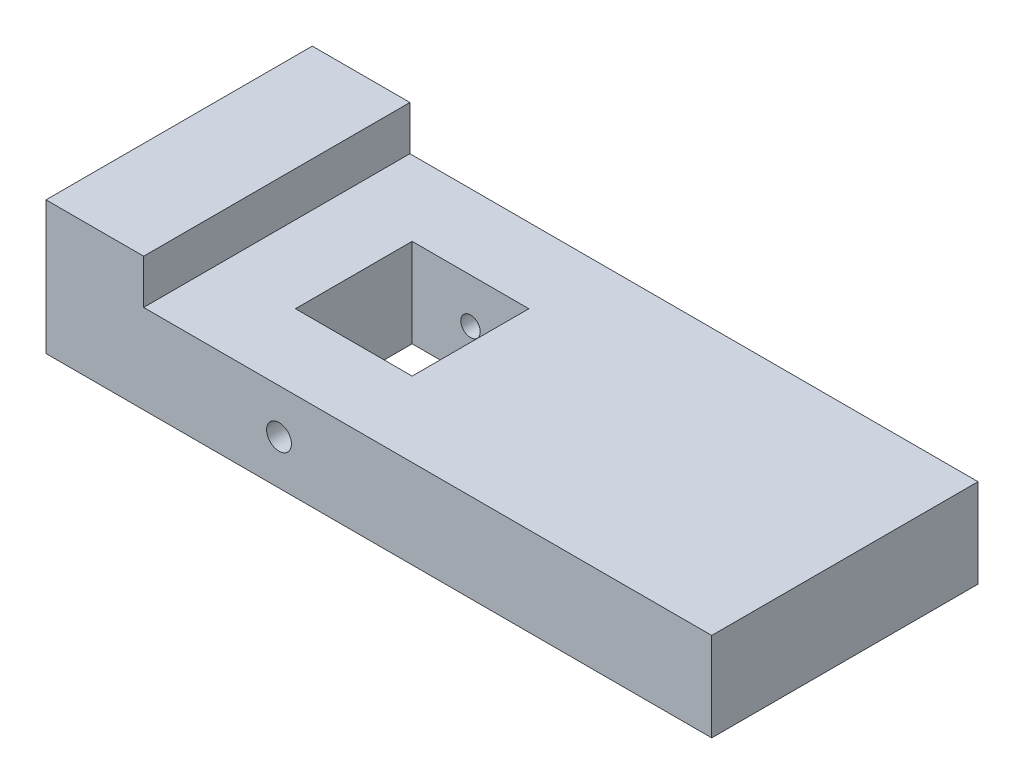
ISO-10303-21;
HEADER;
FILE_DESCRIPTION(('STEP AP214'),'2;1');
FILE_NAME('part.step','',(''),(''),'','','');
FILE_SCHEMA(('AUTOMOTIVE_DESIGN { 1 0 10303 214 1 1 1 1 }'));
ENDSEC;
DATA;
#1=APPLICATION_CONTEXT('core data for automotive mechanical design processes');
#2=APPLICATION_PROTOCOL_DEFINITION('international standard','automotive_design',2000,#1);
#3=PRODUCT_CONTEXT('',#1,'mechanical');
#4=PRODUCT('Part','Part','',(#3));
#5=PRODUCT_RELATED_PRODUCT_CATEGORY('part','',(#4));
#6=PRODUCT_DEFINITION_FORMATION('','',#4);
#7=PRODUCT_DEFINITION_CONTEXT('part definition',#1,'design');
#8=PRODUCT_DEFINITION('design','',#6,#7);
#9=PRODUCT_DEFINITION_SHAPE('','',#8);
#10=(LENGTH_UNIT() NAMED_UNIT(*) SI_UNIT(.MILLI.,.METRE.));
#11=(NAMED_UNIT(*) PLANE_ANGLE_UNIT() SI_UNIT($,.RADIAN.));
#12=(NAMED_UNIT(*) SI_UNIT($,.STERADIAN.) SOLID_ANGLE_UNIT());
#13=UNCERTAINTY_MEASURE_WITH_UNIT(LENGTH_MEASURE(1.E-05),#10,'distance_accuracy_value','');
#14=(GEOMETRIC_REPRESENTATION_CONTEXT(3) GLOBAL_UNCERTAINTY_ASSIGNED_CONTEXT((#13)) GLOBAL_UNIT_ASSIGNED_CONTEXT((#10,
#11,#12)) REPRESENTATION_CONTEXT('',''));
#15=CARTESIAN_POINT('',(0.,0.,0.));
#16=DIRECTION('',(0.,0.,1.));
#17=DIRECTION('',(1.,0.,0.));
#18=AXIS2_PLACEMENT_3D('',#15,#16,#17);
#19=CARTESIAN_POINT('',(-22.5,10.,-30.));
#20=DIRECTION('',(0.,0.,1.));
#21=DIRECTION('',(1.,0.,0.));
#22=AXIS2_PLACEMENT_3D('',#19,#20,#21);
#23=CYLINDRICAL_SURFACE('',#22,2.2);
#24=CARTESIAN_POINT('',(-22.5,10.,13.15));
#25=DIRECTION('',(0.,0.,1.));
#26=DIRECTION('',(1.,0.,0.));
#27=AXIS2_PLACEMENT_3D('',#24,#25,#26);
#28=CIRCLE('',#27,2.2);
#29=CARTESIAN_POINT('',(-20.3,10.,13.15));
#30=VERTEX_POINT('',#29);
#31=EDGE_CURVE('E200',#30,#30,#28,.T.);
#32=ORIENTED_EDGE('',*,*,#31,.F.);
#33=EDGE_LOOP('',(#32));
#34=FACE_BOUND('',#33,.T.);
#35=CARTESIAN_POINT('',(-22.5,10.,24.));
#36=DIRECTION('',(0.,0.,1.));
#37=DIRECTION('',(1.,0.,0.));
#38=AXIS2_PLACEMENT_3D('',#35,#36,#37);
#39=CIRCLE('',#38,2.2);
#40=CARTESIAN_POINT('',(-20.3,10.,24.));
#41=VERTEX_POINT('',#40);
#42=EDGE_CURVE('E43',#41,#41,#39,.F.);
#43=ORIENTED_EDGE('',*,*,#42,.F.);
#44=EDGE_LOOP('',(#43));
#45=FACE_BOUND('',#44,.T.);
#46=ADVANCED_FACE('F39',(#34,#45),#23,.F.);
#47=CARTESIAN_POINT('',(0.,20.,0.));
#48=DIRECTION('',(0.,-1.,0.));
#49=DIRECTION('',(0.,0.,-1.));
#50=AXIS2_PLACEMENT_3D('',#47,#48,#49);
#51=PLANE('',#50);
#52=DIRECTION('',(1.,0.,0.));
#53=VECTOR('',#52,1.);
#54=CARTESIAN_POINT('',(-9.35,20.,13.15));
#55=LINE('',#54,#53);
#56=CARTESIAN_POINT('',(-35.65,20.,13.15));
#57=VERTEX_POINT('',#56);
#58=CARTESIAN_POINT('',(-9.35,20.,13.15));
#59=VERTEX_POINT('',#58);
#60=EDGE_CURVE('E148',#57,#59,#55,.T.);
#61=ORIENTED_EDGE('',*,*,#60,.F.);
#62=DIRECTION('',(0.,0.,1.));
#63=VECTOR('',#62,1.);
#64=CARTESIAN_POINT('',(-35.65,20.,13.15));
#65=LINE('',#64,#63);
#66=CARTESIAN_POINT('',(-35.65,20.,-13.15));
#67=VERTEX_POINT('',#66);
#68=EDGE_CURVE('E56',#67,#57,#65,.T.);
#69=ORIENTED_EDGE('',*,*,#68,.F.);
#70=DIRECTION('',(-1.,0.,0.));
#71=VECTOR('',#70,1.);
#72=CARTESIAN_POINT('',(-9.35,20.,-13.15));
#73=LINE('',#72,#71);
#74=CARTESIAN_POINT('',(-9.35,20.,-13.15));
#75=VERTEX_POINT('',#74);
#76=EDGE_CURVE('E136',#75,#67,#73,.T.);
#77=ORIENTED_EDGE('',*,*,#76,.F.);
#78=DIRECTION('',(0.,0.,-1.));
#79=VECTOR('',#78,1.);
#80=CARTESIAN_POINT('',(-9.35,20.,13.15));
#81=LINE('',#80,#79);
#82=EDGE_CURVE('E139',#59,#75,#81,.T.);
#83=ORIENTED_EDGE('',*,*,#82,.F.);
#84=EDGE_LOOP('',(#61,#69,#77,#83));
#85=FACE_BOUND('',#84,.T.);
#86=DIRECTION('',(0.,0.,-1.));
#87=VECTOR('',#86,1.);
#88=CARTESIAN_POINT('',(-53.,20.,30.));
#89=LINE('',#88,#87);
#90=CARTESIAN_POINT('',(-53.,20.,30.));
#91=VERTEX_POINT('',#90);
#92=CARTESIAN_POINT('',(-53.,20.,-30.));
#93=VERTEX_POINT('',#92);
#94=EDGE_CURVE('E154',#91,#93,#89,.T.);
#95=ORIENTED_EDGE('',*,*,#94,.F.);
#96=DIRECTION('',(1.,0.,0.));
#97=VECTOR('',#96,1.);
#98=CARTESIAN_POINT('',(-75.,20.,30.));
#99=LINE('',#98,#97);
#100=CARTESIAN_POINT('',(75.,20.,30.));
#101=VERTEX_POINT('',#100);
#102=EDGE_CURVE('E184',#91,#101,#99,.T.);
#103=ORIENTED_EDGE('',*,*,#102,.T.);
#104=DIRECTION('',(0.,0.,-1.));
#105=VECTOR('',#104,1.);
#106=CARTESIAN_POINT('',(75.,20.,30.));
#107=LINE('',#106,#105);
#108=CARTESIAN_POINT('',(75.,20.,-30.));
#109=VERTEX_POINT('',#108);
#110=EDGE_CURVE('E178',#101,#109,#107,.T.);
#111=ORIENTED_EDGE('',*,*,#110,.T.);
#112=DIRECTION('',(-1.,0.,0.));
#113=VECTOR('',#112,1.);
#114=CARTESIAN_POINT('',(-75.,20.,-30.));
#115=LINE('',#114,#113);
#116=EDGE_CURVE('E181',#109,#93,#115,.T.);
#117=ORIENTED_EDGE('',*,*,#116,.T.);
#118=EDGE_LOOP('',(#95,#103,#111,#117));
#119=FACE_BOUND('',#118,.T.);
#120=ADVANCED_FACE('F264',(#85,#119),#51,.F.);
#121=CARTESIAN_POINT('',(75.,20.,30.));
#122=DIRECTION('',(-1.,0.,0.));
#123=DIRECTION('',(0.,0.,1.));
#124=AXIS2_PLACEMENT_3D('',#121,#122,#123);
#125=PLANE('',#124);
#126=DIRECTION('',(0.,0.,-1.));
#127=VECTOR('',#126,1.);
#128=CARTESIAN_POINT('',(75.,0.,30.));
#129=LINE('',#128,#127);
#130=CARTESIAN_POINT('',(75.,0.,30.));
#131=VERTEX_POINT('',#130);
#132=CARTESIAN_POINT('',(75.,0.,-30.));
#133=VERTEX_POINT('',#132);
#134=EDGE_CURVE('E177',#131,#133,#129,.T.);
#135=ORIENTED_EDGE('',*,*,#134,.T.);
#136=DIRECTION('',(0.,-1.,0.));
#137=VECTOR('',#136,1.);
#138=CARTESIAN_POINT('',(75.,20.,-30.));
#139=LINE('',#138,#137);
#140=EDGE_CURVE('E11',#109,#133,#139,.T.);
#141=ORIENTED_EDGE('',*,*,#140,.F.);
#142=ORIENTED_EDGE('',*,*,#110,.F.);
#143=DIRECTION('',(0.,-1.,0.));
#144=VECTOR('',#143,1.);
#145=CARTESIAN_POINT('',(75.,20.,30.));
#146=LINE('',#145,#144);
#147=EDGE_CURVE('E186',#101,#131,#146,.T.);
#148=ORIENTED_EDGE('',*,*,#147,.T.);
#149=EDGE_LOOP('',(#135,#141,#142,#148));
#150=FACE_BOUND('',#149,.T.);
#151=ADVANCED_FACE('F41',(#150),#125,.F.);
#152=CARTESIAN_POINT('',(-75.,20.,-30.));
#153=DIRECTION('',(0.,0.,1.));
#154=DIRECTION('',(1.,0.,0.));
#155=AXIS2_PLACEMENT_3D('',#152,#153,#154);
#156=PLANE('',#155);
#157=CARTESIAN_POINT('',(-22.5,10.,-30.));
#158=DIRECTION('',(0.,0.,1.));
#159=DIRECTION('',(1.,0.,0.));
#160=AXIS2_PLACEMENT_3D('',#157,#158,#159);
#161=CIRCLE('',#160,2.2);
#162=CARTESIAN_POINT('',(-20.3,10.,-30.));
#163=VERTEX_POINT('',#162);
#164=EDGE_CURVE('E202',#163,#163,#161,.T.);
#165=ORIENTED_EDGE('',*,*,#164,.T.);
#166=EDGE_LOOP('',(#165));
#167=FACE_BOUND('',#166,.T.);
#168=DIRECTION('',(-1.,0.,0.));
#169=VECTOR('',#168,1.);
#170=CARTESIAN_POINT('',(-75.,0.,-30.));
#171=LINE('',#170,#169);
#172=CARTESIAN_POINT('',(-75.,0.,-30.));
#173=VERTEX_POINT('',#172);
#174=EDGE_CURVE('E189',#133,#173,#171,.T.);
#175=ORIENTED_EDGE('',*,*,#174,.T.);
#176=DIRECTION('',(0.,-1.,0.));
#177=VECTOR('',#176,1.);
#178=CARTESIAN_POINT('',(-75.,20.,-30.));
#179=LINE('',#178,#177);
#180=CARTESIAN_POINT('',(-75.,30.,-30.));
#181=VERTEX_POINT('',#180);
#182=EDGE_CURVE('E48',#181,#173,#179,.T.);
#183=ORIENTED_EDGE('',*,*,#182,.F.);
#184=DIRECTION('',(-1.,0.,0.));
#185=VECTOR('',#184,1.);
#186=CARTESIAN_POINT('',(-75.,30.,-30.));
#187=LINE('',#186,#185);
#188=CARTESIAN_POINT('',(-53.,30.,-30.));
#189=VERTEX_POINT('',#188);
#190=EDGE_CURVE('E161',#189,#181,#187,.T.);
#191=ORIENTED_EDGE('',*,*,#190,.F.);
#192=DIRECTION('',(0.,-1.,0.));
#193=VECTOR('',#192,1.);
#194=CARTESIAN_POINT('',(-53.,30.,-30.));
#195=LINE('',#194,#193);
#196=EDGE_CURVE('E174',#189,#93,#195,.T.);
#197=ORIENTED_EDGE('',*,*,#196,.T.);
#198=ORIENTED_EDGE('',*,*,#116,.F.);
#199=ORIENTED_EDGE('',*,*,#140,.T.);
#200=EDGE_LOOP('',(#175,#183,#191,#197,#198,#199));
#201=FACE_BOUND('',#200,.T.);
#202=ADVANCED_FACE('F313',(#167,#201),#156,.F.);
#203=CARTESIAN_POINT('',(-75.,20.,30.));
#204=DIRECTION('',(1.,0.,0.));
#205=DIRECTION('',(0.,0.,-1.));
#206=AXIS2_PLACEMENT_3D('',#203,#204,#205);
#207=PLANE('',#206);
#208=DIRECTION('',(0.,0.,1.));
#209=VECTOR('',#208,1.);
#210=CARTESIAN_POINT('',(-75.,0.,30.));
#211=LINE('',#210,#209);
#212=CARTESIAN_POINT('',(-75.,0.,30.));
#213=VERTEX_POINT('',#212);
#214=EDGE_CURVE('E191',#173,#213,#211,.T.);
#215=ORIENTED_EDGE('',*,*,#214,.T.);
#216=DIRECTION('',(0.,-1.,0.));
#217=VECTOR('',#216,1.);
#218=CARTESIAN_POINT('',(-75.,20.,30.));
#219=LINE('',#218,#217);
#220=CARTESIAN_POINT('',(-75.,30.,30.));
#221=VERTEX_POINT('',#220);
#222=EDGE_CURVE('E196',#221,#213,#219,.T.);
#223=ORIENTED_EDGE('',*,*,#222,.F.);
#224=DIRECTION('',(0.,0.,1.));
#225=VECTOR('',#224,1.);
#226=CARTESIAN_POINT('',(-75.,30.,30.));
#227=LINE('',#226,#225);
#228=EDGE_CURVE('E164',#181,#221,#227,.T.);
#229=ORIENTED_EDGE('',*,*,#228,.F.);
#230=ORIENTED_EDGE('',*,*,#182,.T.);
#231=EDGE_LOOP('',(#215,#223,#229,#230));
#232=FACE_BOUND('',#231,.T.);
#233=ADVANCED_FACE('F310',(#232),#207,.F.);
#234=CARTESIAN_POINT('',(-75.,20.,30.));
#235=DIRECTION('',(0.,0.,-1.));
#236=DIRECTION('',(-1.,0.,0.));
#237=AXIS2_PLACEMENT_3D('',#234,#235,#236);
#238=PLANE('',#237);
#239=CARTESIAN_POINT('',(-22.5,10.,30.));
#240=DIRECTION('',(0.,0.,1.));
#241=DIRECTION('',(1.,0.,0.));
#242=AXIS2_PLACEMENT_3D('',#239,#240,#241);
#243=CIRCLE('',#242,2.8);
#244=CARTESIAN_POINT('',(-19.7,10.,30.));
#245=VERTEX_POINT('',#244);
#246=EDGE_CURVE('E212',#245,#245,#243,.T.);
#247=ORIENTED_EDGE('',*,*,#246,.F.);
#248=EDGE_LOOP('',(#247));
#249=FACE_BOUND('',#248,.T.);
#250=DIRECTION('',(1.,0.,0.));
#251=VECTOR('',#250,1.);
#252=CARTESIAN_POINT('',(-75.,0.,30.));
#253=LINE('',#252,#251);
#254=EDGE_CURVE('E182',#213,#131,#253,.T.);
#255=ORIENTED_EDGE('',*,*,#254,.T.);
#256=ORIENTED_EDGE('',*,*,#147,.F.);
#257=ORIENTED_EDGE('',*,*,#102,.F.);
#258=DIRECTION('',(0.,-1.,0.));
#259=VECTOR('',#258,1.);
#260=CARTESIAN_POINT('',(-53.,30.,30.));
#261=LINE('',#260,#259);
#262=CARTESIAN_POINT('',(-53.,30.,30.));
#263=VERTEX_POINT('',#262);
#264=EDGE_CURVE('E169',#263,#91,#261,.T.);
#265=ORIENTED_EDGE('',*,*,#264,.F.);
#266=DIRECTION('',(1.,0.,0.));
#267=VECTOR('',#266,1.);
#268=CARTESIAN_POINT('',(-75.,30.,30.));
#269=LINE('',#268,#267);
#270=EDGE_CURVE('E167',#221,#263,#269,.T.);
#271=ORIENTED_EDGE('',*,*,#270,.F.);
#272=ORIENTED_EDGE('',*,*,#222,.T.);
#273=EDGE_LOOP('',(#255,#256,#257,#265,#271,#272));
#274=FACE_BOUND('',#273,.T.);
#275=ADVANCED_FACE('F241',(#249,#274),#238,.F.);
#276=CARTESIAN_POINT('',(0.,0.,0.));
#277=DIRECTION('',(0.,-1.,0.));
#278=DIRECTION('',(0.,0.,-1.));
#279=AXIS2_PLACEMENT_3D('',#276,#277,#278);
#280=PLANE('',#279);
#281=CARTESIAN_POINT('',(-55.,0.,0.));
#282=DIRECTION('',(0.,-1.,0.));
#283=DIRECTION('',(0.,0.,-1.));
#284=AXIS2_PLACEMENT_3D('',#281,#282,#283);
#285=CIRCLE('',#284,4.00000000000001);
#286=CARTESIAN_POINT('',(-55.,0.,-4.00000000000001));
#287=VERTEX_POINT('',#286);
#288=EDGE_CURVE('E227',#287,#287,#285,.T.);
#289=ORIENTED_EDGE('',*,*,#288,.F.);
#290=EDGE_LOOP('',(#289));
#291=FACE_BOUND('',#290,.T.);
#292=CARTESIAN_POINT('',(55.,0.,0.));
#293=DIRECTION('',(0.,-1.,0.));
#294=DIRECTION('',(0.,0.,-1.));
#295=AXIS2_PLACEMENT_3D('',#292,#293,#294);
#296=CIRCLE('',#295,4.00000000000001);
#297=CARTESIAN_POINT('',(55.,0.,-4.00000000000001));
#298=VERTEX_POINT('',#297);
#299=EDGE_CURVE('E221',#298,#298,#296,.T.);
#300=ORIENTED_EDGE('',*,*,#299,.F.);
#301=EDGE_LOOP('',(#300));
#302=FACE_BOUND('',#301,.T.);
#303=CARTESIAN_POINT('',(0.,0.,0.));
#304=DIRECTION('',(0.,-1.,0.));
#305=DIRECTION('',(0.,0.,-1.));
#306=AXIS2_PLACEMENT_3D('',#303,#304,#305);
#307=CIRCLE('',#306,4.);
#308=CARTESIAN_POINT('',(0.,0.,-4.00000000000001));
#309=VERTEX_POINT('',#308);
#310=EDGE_CURVE('E218',#309,#309,#307,.T.);
#311=ORIENTED_EDGE('',*,*,#310,.F.);
#312=EDGE_LOOP('',(#311));
#313=FACE_BOUND('',#312,.T.);
#314=DIRECTION('',(0.,0.,1.));
#315=VECTOR('',#314,1.);
#316=CARTESIAN_POINT('',(-35.65,0.,13.15));
#317=LINE('',#316,#315);
#318=CARTESIAN_POINT('',(-35.65,0.,-13.15));
#319=VERTEX_POINT('',#318);
#320=CARTESIAN_POINT('',(-35.65,0.,13.15));
#321=VERTEX_POINT('',#320);
#322=EDGE_CURVE('E120',#319,#321,#317,.T.);
#323=ORIENTED_EDGE('',*,*,#322,.T.);
#324=DIRECTION('',(1.,0.,0.));
#325=VECTOR('',#324,1.);
#326=CARTESIAN_POINT('',(-9.35,0.,13.15));
#327=LINE('',#326,#325);
#328=CARTESIAN_POINT('',(-9.35,0.,13.15));
#329=VERTEX_POINT('',#328);
#330=EDGE_CURVE('E129',#321,#329,#327,.T.);
#331=ORIENTED_EDGE('',*,*,#330,.T.);
#332=DIRECTION('',(0.,0.,-1.));
#333=VECTOR('',#332,1.);
#334=CARTESIAN_POINT('',(-9.35,0.,13.15));
#335=LINE('',#334,#333);
#336=CARTESIAN_POINT('',(-9.35,0.,-13.15));
#337=VERTEX_POINT('',#336);
#338=EDGE_CURVE('E64',#329,#337,#335,.T.);
#339=ORIENTED_EDGE('',*,*,#338,.T.);
#340=DIRECTION('',(-1.,0.,0.));
#341=VECTOR('',#340,1.);
#342=CARTESIAN_POINT('',(-9.35,0.,-13.15));
#343=LINE('',#342,#341);
#344=EDGE_CURVE('E126',#337,#319,#343,.T.);
#345=ORIENTED_EDGE('',*,*,#344,.T.);
#346=EDGE_LOOP('',(#323,#331,#339,#345));
#347=FACE_BOUND('',#346,.T.);
#348=ORIENTED_EDGE('',*,*,#134,.F.);
#349=ORIENTED_EDGE('',*,*,#254,.F.);
#350=ORIENTED_EDGE('',*,*,#214,.F.);
#351=ORIENTED_EDGE('',*,*,#174,.F.);
#352=EDGE_LOOP('',(#348,#349,#350,#351));
#353=FACE_BOUND('',#352,.T.);
#354=ADVANCED_FACE('F133',(#291,#302,#313,#347,#353),#280,.T.);
#355=CARTESIAN_POINT('',(-53.,30.,30.));
#356=DIRECTION('',(-1.,0.,0.));
#357=DIRECTION('',(0.,0.,1.));
#358=AXIS2_PLACEMENT_3D('',#355,#356,#357);
#359=PLANE('',#358);
#360=ORIENTED_EDGE('',*,*,#94,.T.);
#361=ORIENTED_EDGE('',*,*,#196,.F.);
#362=DIRECTION('',(0.,0.,-1.));
#363=VECTOR('',#362,1.);
#364=CARTESIAN_POINT('',(-53.,30.,30.));
#365=LINE('',#364,#363);
#366=EDGE_CURVE('E158',#263,#189,#365,.T.);
#367=ORIENTED_EDGE('',*,*,#366,.F.);
#368=ORIENTED_EDGE('',*,*,#264,.T.);
#369=EDGE_LOOP('',(#360,#361,#367,#368));
#370=FACE_BOUND('',#369,.T.);
#371=ADVANCED_FACE('F240',(#370),#359,.F.);
#372=CARTESIAN_POINT('',(0.,30.,0.));
#373=DIRECTION('',(0.,-1.,0.));
#374=DIRECTION('',(0.,0.,-1.));
#375=AXIS2_PLACEMENT_3D('',#372,#373,#374);
#376=PLANE('',#375);
#377=ORIENTED_EDGE('',*,*,#366,.T.);
#378=ORIENTED_EDGE('',*,*,#190,.T.);
#379=ORIENTED_EDGE('',*,*,#228,.T.);
#380=ORIENTED_EDGE('',*,*,#270,.T.);
#381=EDGE_LOOP('',(#377,#378,#379,#380));
#382=FACE_BOUND('',#381,.T.);
#383=ADVANCED_FACE('F302',(#382),#376,.F.);
#384=CARTESIAN_POINT('',(-35.65,0.,13.15));
#385=DIRECTION('',(-1.,0.,0.));
#386=DIRECTION('',(0.,0.,1.));
#387=AXIS2_PLACEMENT_3D('',#384,#385,#386);
#388=PLANE('',#387);
#389=ORIENTED_EDGE('',*,*,#68,.T.);
#390=DIRECTION('',(0.,1.,0.));
#391=VECTOR('',#390,1.);
#392=CARTESIAN_POINT('',(-35.65,0.,13.15));
#393=LINE('',#392,#391);
#394=EDGE_CURVE('E116',#321,#57,#393,.T.);
#395=ORIENTED_EDGE('',*,*,#394,.F.);
#396=ORIENTED_EDGE('',*,*,#322,.F.);
#397=DIRECTION('',(0.,1.,0.));
#398=VECTOR('',#397,1.);
#399=CARTESIAN_POINT('',(-35.65,0.,-13.15));
#400=LINE('',#399,#398);
#401=EDGE_CURVE('E152',#319,#67,#400,.T.);
#402=ORIENTED_EDGE('',*,*,#401,.T.);
#403=EDGE_LOOP('',(#389,#395,#396,#402));
#404=FACE_BOUND('',#403,.T.);
#405=ADVANCED_FACE('F118',(#404),#388,.F.);
#406=CARTESIAN_POINT('',(-9.35,0.,-13.15));
#407=DIRECTION('',(0.,0.,-1.));
#408=DIRECTION('',(-1.,0.,0.));
#409=AXIS2_PLACEMENT_3D('',#406,#407,#408);
#410=PLANE('',#409);
#411=CARTESIAN_POINT('',(-22.5,10.,-13.15));
#412=DIRECTION('',(0.,0.,-1.));
#413=DIRECTION('',(-1.,0.,0.));
#414=AXIS2_PLACEMENT_3D('',#411,#412,#413);
#415=CIRCLE('',#414,2.2);
#416=CARTESIAN_POINT('',(-24.7,10.,-13.15));
#417=VERTEX_POINT('',#416);
#418=EDGE_CURVE('E142',#417,#417,#415,.T.);
#419=ORIENTED_EDGE('',*,*,#418,.T.);
#420=EDGE_LOOP('',(#419));
#421=FACE_BOUND('',#420,.T.);
#422=ORIENTED_EDGE('',*,*,#76,.T.);
#423=ORIENTED_EDGE('',*,*,#401,.F.);
#424=ORIENTED_EDGE('',*,*,#344,.F.);
#425=DIRECTION('',(0.,1.,0.));
#426=VECTOR('',#425,1.);
#427=CARTESIAN_POINT('',(-9.35,0.,-13.15));
#428=LINE('',#427,#426);
#429=EDGE_CURVE('E155',#337,#75,#428,.T.);
#430=ORIENTED_EDGE('',*,*,#429,.T.);
#431=EDGE_LOOP('',(#422,#423,#424,#430));
#432=FACE_BOUND('',#431,.T.);
#433=ADVANCED_FACE('F288',(#421,#432),#410,.F.);
#434=CARTESIAN_POINT('',(-9.35,0.,13.15));
#435=DIRECTION('',(1.,0.,0.));
#436=DIRECTION('',(0.,0.,-1.));
#437=AXIS2_PLACEMENT_3D('',#434,#435,#436);
#438=PLANE('',#437);
#439=ORIENTED_EDGE('',*,*,#82,.T.);
#440=ORIENTED_EDGE('',*,*,#429,.F.);
#441=ORIENTED_EDGE('',*,*,#338,.F.);
#442=DIRECTION('',(0.,1.,0.));
#443=VECTOR('',#442,1.);
#444=CARTESIAN_POINT('',(-9.35,0.,13.15));
#445=LINE('',#444,#443);
#446=EDGE_CURVE('E125',#329,#59,#445,.T.);
#447=ORIENTED_EDGE('',*,*,#446,.T.);
#448=EDGE_LOOP('',(#439,#440,#441,#447));
#449=FACE_BOUND('',#448,.T.);
#450=ADVANCED_FACE('F283',(#449),#438,.F.);
#451=CARTESIAN_POINT('',(-9.35,0.,13.15));
#452=DIRECTION('',(0.,0.,1.));
#453=DIRECTION('',(1.,0.,0.));
#454=AXIS2_PLACEMENT_3D('',#451,#452,#453);
#455=PLANE('',#454);
#456=ORIENTED_EDGE('',*,*,#31,.T.);
#457=EDGE_LOOP('',(#456));
#458=FACE_BOUND('',#457,.T.);
#459=ORIENTED_EDGE('',*,*,#60,.T.);
#460=ORIENTED_EDGE('',*,*,#446,.F.);
#461=ORIENTED_EDGE('',*,*,#330,.F.);
#462=ORIENTED_EDGE('',*,*,#394,.T.);
#463=EDGE_LOOP('',(#459,#460,#461,#462));
#464=FACE_BOUND('',#463,.T.);
#465=ADVANCED_FACE('F130',(#458,#464),#455,.F.);
#466=ORIENTED_EDGE('',*,*,#164,.F.);
#467=EDGE_LOOP('',(#466));
#468=FACE_BOUND('',#467,.T.);
#469=ORIENTED_EDGE('',*,*,#418,.F.);
#470=EDGE_LOOP('',(#469));
#471=FACE_BOUND('',#470,.T.);
#472=ADVANCED_FACE('F267',(#468,#471),#23,.F.);
#473=CARTESIAN_POINT('',(-22.5,10.,24.));
#474=DIRECTION('',(0.,0.,1.));
#475=DIRECTION('',(1.,0.,0.));
#476=AXIS2_PLACEMENT_3D('',#473,#474,#475);
#477=PLANE('',#476);
#478=CARTESIAN_POINT('',(-22.5,10.,24.));
#479=DIRECTION('',(0.,0.,1.));
#480=DIRECTION('',(1.,0.,0.));
#481=AXIS2_PLACEMENT_3D('',#478,#479,#480);
#482=CIRCLE('',#481,2.8);
#483=CARTESIAN_POINT('',(-19.7,10.,24.));
#484=VERTEX_POINT('',#483);
#485=EDGE_CURVE('E210',#484,#484,#482,.T.);
#486=ORIENTED_EDGE('',*,*,#485,.T.);
#487=EDGE_LOOP('',(#486));
#488=FACE_BOUND('',#487,.T.);
#489=ORIENTED_EDGE('',*,*,#42,.T.);
#490=EDGE_LOOP('',(#489));
#491=FACE_BOUND('',#490,.T.);
#492=ADVANCED_FACE('F258',(#488,#491),#477,.T.);
#493=CARTESIAN_POINT('',(-22.5,10.,24.));
#494=DIRECTION('',(0.,0.,1.));
#495=DIRECTION('',(1.,0.,0.));
#496=AXIS2_PLACEMENT_3D('',#493,#494,#495);
#497=CYLINDRICAL_SURFACE('',#496,2.8);
#498=ORIENTED_EDGE('',*,*,#485,.F.);
#499=EDGE_LOOP('',(#498));
#500=FACE_BOUND('',#499,.T.);
#501=ORIENTED_EDGE('',*,*,#246,.T.);
#502=EDGE_LOOP('',(#501));
#503=FACE_BOUND('',#502,.T.);
#504=ADVANCED_FACE('F249',(#500,#503),#497,.F.);
#505=CARTESIAN_POINT('',(0.,2.,0.));
#506=DIRECTION('',(0.,-1.,0.));
#507=DIRECTION('',(0.,0.,-1.));
#508=AXIS2_PLACEMENT_3D('',#505,#506,#507);
#509=CYLINDRICAL_SURFACE('',#508,4.);
#510=CARTESIAN_POINT('',(0.,2.,0.));
#511=DIRECTION('',(0.,-1.,0.));
#512=DIRECTION('',(0.,0.,-1.));
#513=AXIS2_PLACEMENT_3D('',#510,#511,#512);
#514=CIRCLE('',#513,4.);
#515=CARTESIAN_POINT('',(0.,2.,-4.00000000000001));
#516=VERTEX_POINT('',#515);
#517=EDGE_CURVE('E215',#516,#516,#514,.T.);
#518=ORIENTED_EDGE('',*,*,#517,.F.);
#519=EDGE_LOOP('',(#518));
#520=FACE_BOUND('',#519,.T.);
#521=ORIENTED_EDGE('',*,*,#310,.T.);
#522=EDGE_LOOP('',(#521));
#523=FACE_BOUND('',#522,.T.);
#524=ADVANCED_FACE('F246',(#520,#523),#509,.F.);
#525=CARTESIAN_POINT('',(0.,2.,0.));
#526=DIRECTION('',(0.,-1.,0.));
#527=DIRECTION('',(0.,0.,-1.));
#528=AXIS2_PLACEMENT_3D('',#525,#526,#527);
#529=PLANE('',#528);
#530=ORIENTED_EDGE('',*,*,#517,.T.);
#531=EDGE_LOOP('',(#530));
#532=FACE_BOUND('',#531,.T.);
#533=ADVANCED_FACE('F248',(#532),#529,.T.);
#534=CARTESIAN_POINT('',(55.,2.,0.));
#535=DIRECTION('',(0.,-1.,0.));
#536=DIRECTION('',(0.,0.,-1.));
#537=AXIS2_PLACEMENT_3D('',#534,#535,#536);
#538=CYLINDRICAL_SURFACE('',#537,4.00000000000001);
#539=CARTESIAN_POINT('',(55.,2.,0.));
#540=DIRECTION('',(0.,-1.,0.));
#541=DIRECTION('',(0.,0.,-1.));
#542=AXIS2_PLACEMENT_3D('',#539,#540,#541);
#543=CIRCLE('',#542,4.00000000000001);
#544=CARTESIAN_POINT('',(55.,2.,-4.00000000000001));
#545=VERTEX_POINT('',#544);
#546=EDGE_CURVE('E230',#545,#545,#543,.T.);
#547=ORIENTED_EDGE('',*,*,#546,.F.);
#548=EDGE_LOOP('',(#547));
#549=FACE_BOUND('',#548,.T.);
#550=ORIENTED_EDGE('',*,*,#299,.T.);
#551=EDGE_LOOP('',(#550));
#552=FACE_BOUND('',#551,.T.);
#553=ADVANCED_FACE('F236',(#549,#552),#538,.F.);
#554=CARTESIAN_POINT('',(55.,2.,0.));
#555=DIRECTION('',(0.,-1.,0.));
#556=DIRECTION('',(0.,0.,-1.));
#557=AXIS2_PLACEMENT_3D('',#554,#555,#556);
#558=PLANE('',#557);
#559=ORIENTED_EDGE('',*,*,#546,.T.);
#560=EDGE_LOOP('',(#559));
#561=FACE_BOUND('',#560,.T.);
#562=ADVANCED_FACE('F418',(#561),#558,.T.);
#563=CARTESIAN_POINT('',(-55.,2.,0.));
#564=DIRECTION('',(0.,-1.,0.));
#565=DIRECTION('',(0.,0.,-1.));
#566=AXIS2_PLACEMENT_3D('',#563,#564,#565);
#567=CYLINDRICAL_SURFACE('',#566,4.00000000000001);
#568=CARTESIAN_POINT('',(-55.,2.,0.));
#569=DIRECTION('',(0.,-1.,0.));
#570=DIRECTION('',(0.,0.,-1.));
#571=AXIS2_PLACEMENT_3D('',#568,#569,#570);
#572=CIRCLE('',#571,4.00000000000001);
#573=CARTESIAN_POINT('',(-55.,2.,-4.00000000000001));
#574=VERTEX_POINT('',#573);
#575=EDGE_CURVE('E224',#574,#574,#572,.T.);
#576=ORIENTED_EDGE('',*,*,#575,.F.);
#577=EDGE_LOOP('',(#576));
#578=FACE_BOUND('',#577,.T.);
#579=ORIENTED_EDGE('',*,*,#288,.T.);
#580=EDGE_LOOP('',(#579));
#581=FACE_BOUND('',#580,.T.);
#582=ADVANCED_FACE('F428',(#578,#581),#567,.F.);
#583=CARTESIAN_POINT('',(-55.,2.,0.));
#584=DIRECTION('',(0.,-1.,0.));
#585=DIRECTION('',(0.,0.,-1.));
#586=AXIS2_PLACEMENT_3D('',#583,#584,#585);
#587=PLANE('',#586);
#588=ORIENTED_EDGE('',*,*,#575,.T.);
#589=EDGE_LOOP('',(#588));
#590=FACE_BOUND('',#589,.T.);
#591=ADVANCED_FACE('F438',(#590),#587,.T.);
#592=CLOSED_SHELL('',(#46,#120,#151,#202,#233,#275,#354,#371,#383,#405,#433,#450,#465,#472,#492,
#504,#524,#533,#553,#562,#582,#591));
#593=MANIFOLD_SOLID_BREP('B2',#592);
#594=ADVANCED_BREP_SHAPE_REPRESENTATION('',(#18,#593),#14);
#595=SHAPE_DEFINITION_REPRESENTATION(#9,#594);
ENDSEC;
END-ISO-10303-21;
